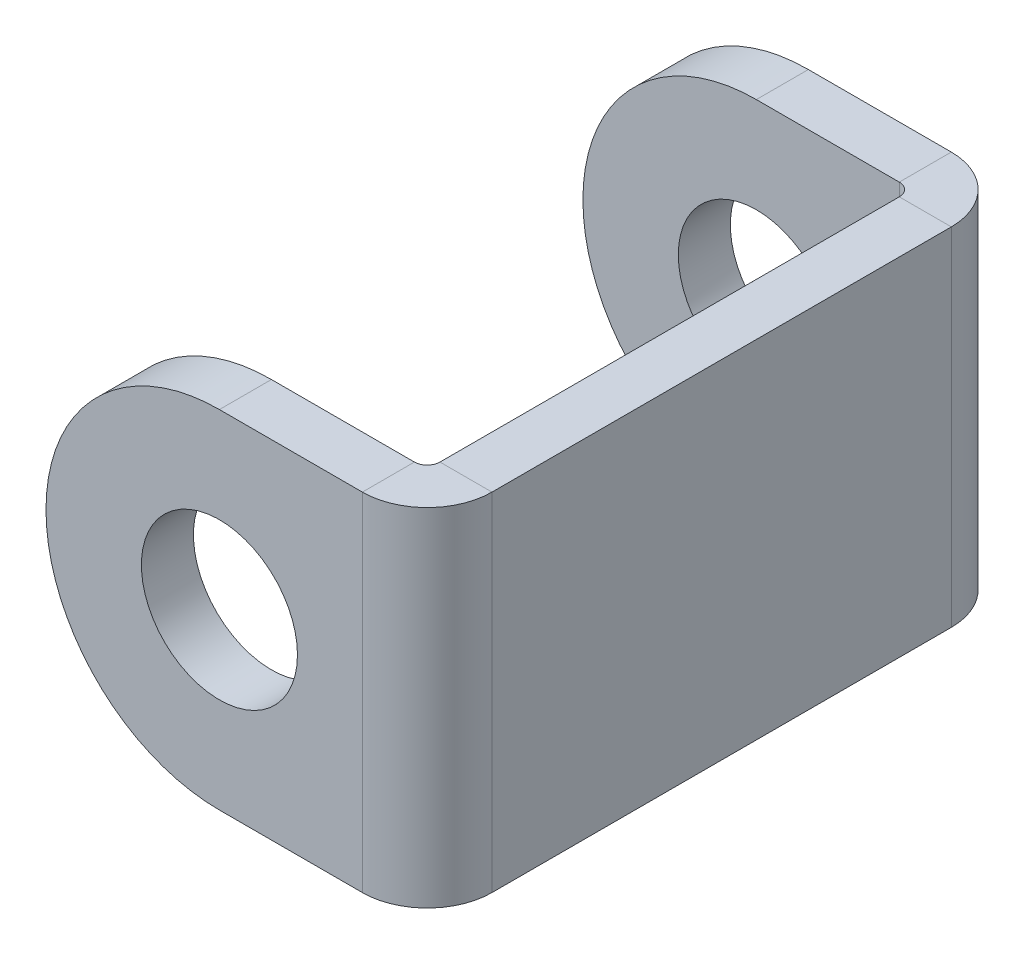
ISO-10303-21;
HEADER;
FILE_DESCRIPTION(('STEP AP214'),'2;1');
FILE_NAME('part.step','',(''),(''),'','','');
FILE_SCHEMA(('AUTOMOTIVE_DESIGN { 1 0 10303 214 1 1 1 1 }'));
ENDSEC;
DATA;
#1=APPLICATION_CONTEXT('core data for automotive mechanical design processes');
#2=APPLICATION_PROTOCOL_DEFINITION('international standard','automotive_design',2000,#1);
#3=PRODUCT_CONTEXT('',#1,'mechanical');
#4=PRODUCT('Part','Part','',(#3));
#5=PRODUCT_RELATED_PRODUCT_CATEGORY('part','',(#4));
#6=PRODUCT_DEFINITION_FORMATION('','',#4);
#7=PRODUCT_DEFINITION_CONTEXT('part definition',#1,'design');
#8=PRODUCT_DEFINITION('design','',#6,#7);
#9=PRODUCT_DEFINITION_SHAPE('','',#8);
#10=(LENGTH_UNIT() NAMED_UNIT(*) SI_UNIT(.MILLI.,.METRE.));
#11=(NAMED_UNIT(*) PLANE_ANGLE_UNIT() SI_UNIT($,.RADIAN.));
#12=(NAMED_UNIT(*) SI_UNIT($,.STERADIAN.) SOLID_ANGLE_UNIT());
#13=UNCERTAINTY_MEASURE_WITH_UNIT(LENGTH_MEASURE(1.E-05),#10,'distance_accuracy_value','');
#14=(GEOMETRIC_REPRESENTATION_CONTEXT(3) GLOBAL_UNCERTAINTY_ASSIGNED_CONTEXT((#13)) GLOBAL_UNIT_ASSIGNED_CONTEXT((#10,
#11,#12)) REPRESENTATION_CONTEXT('',''));
#15=CARTESIAN_POINT('',(0.,0.,0.));
#16=DIRECTION('',(0.,0.,1.));
#17=DIRECTION('',(1.,0.,0.));
#18=AXIS2_PLACEMENT_3D('',#15,#16,#17);
#19=CARTESIAN_POINT('',(18.9799784677453,0.,-21.0200215322547));
#20=DIRECTION('',(1.,0.,0.));
#21=DIRECTION('',(0.,0.,-1.));
#22=AXIS2_PLACEMENT_3D('',#19,#20,#21);
#23=PLANE('',#22);
#24=DIRECTION('',(0.,0.,1.));
#25=VECTOR('',#24,1.);
#26=CARTESIAN_POINT('',(18.9799784677453,0.,-21.0200215322547));
#27=LINE('',#26,#25);
#28=CARTESIAN_POINT('',(18.9799784677453,0.,0.736600000000002));
#29=VERTEX_POINT('',#28);
#30=CARTESIAN_POINT('',(18.9799784677452,0.,27.2233569354905));
#31=VERTEX_POINT('',#30);
#32=EDGE_CURVE('E204',#29,#31,#27,.T.);
#33=ORIENTED_EDGE('',*,*,#32,.T.);
#34=DIRECTION('',(0.,1.,0.));
#35=VECTOR('',#34,1.);
#36=CARTESIAN_POINT('',(18.9799784677452,0.,27.2233569354905));
#37=LINE('',#36,#35);
#38=CARTESIAN_POINT('',(18.9799784677452,20.,27.2233569354905));
#39=VERTEX_POINT('',#38);
#40=EDGE_CURVE('E238',#31,#39,#37,.T.);
#41=ORIENTED_EDGE('',*,*,#40,.T.);
#42=DIRECTION('',(0.,0.,-1.));
#43=VECTOR('',#42,1.);
#44=CARTESIAN_POINT('',(18.9799784677453,20.,-21.0200215322547));
#45=LINE('',#44,#43);
#46=CARTESIAN_POINT('',(18.9799784677453,20.,0.736600000000002));
#47=VERTEX_POINT('',#46);
#48=EDGE_CURVE('E247',#39,#47,#45,.T.);
#49=ORIENTED_EDGE('',*,*,#48,.T.);
#50=DIRECTION('',(0.,1.,0.));
#51=VECTOR('',#50,1.);
#52=CARTESIAN_POINT('',(18.9799784677453,0.,0.736600000000004));
#53=LINE('',#52,#51);
#54=EDGE_CURVE('E230',#29,#47,#53,.T.);
#55=ORIENTED_EDGE('',*,*,#54,.F.);
#56=EDGE_LOOP('',(#33,#41,#49,#55));
#57=FACE_BOUND('',#56,.T.);
#58=ADVANCED_FACE('F44',(#57),#23,.F.);
#59=CARTESIAN_POINT('',(21.9799784677453,0.,-21.0200215322547));
#60=DIRECTION('',(0.,-1.,0.));
#61=DIRECTION('',(1.,0.,0.));
#62=AXIS2_PLACEMENT_3D('',#59,#60,#61);
#63=PLANE('',#62);
#64=DIRECTION('',(1.,0.,0.));
#65=VECTOR('',#64,1.);
#66=CARTESIAN_POINT('',(21.9799784677452,0.,27.2233569354905));
#67=LINE('',#66,#65);
#68=CARTESIAN_POINT('',(21.9799784677452,0.,27.2233569354905));
#69=VERTEX_POINT('',#68);
#70=EDGE_CURVE('E241',#31,#69,#67,.T.);
#71=ORIENTED_EDGE('',*,*,#70,.F.);
#72=ORIENTED_EDGE('',*,*,#32,.F.);
#73=DIRECTION('',(1.,0.,0.));
#74=VECTOR('',#73,1.);
#75=CARTESIAN_POINT('',(21.9799784677453,0.,0.736600000000014));
#76=LINE('',#75,#74);
#77=CARTESIAN_POINT('',(21.9799784677453,0.,0.736600000000012));
#78=VERTEX_POINT('',#77);
#79=EDGE_CURVE('E226',#29,#78,#76,.T.);
#80=ORIENTED_EDGE('',*,*,#79,.T.);
#81=DIRECTION('',(0.,0.,1.));
#82=VECTOR('',#81,1.);
#83=CARTESIAN_POINT('',(21.9799784677453,0.,-21.0200215322547));
#84=LINE('',#83,#82);
#85=EDGE_CURVE('E245',#78,#69,#84,.T.);
#86=ORIENTED_EDGE('',*,*,#85,.T.);
#87=EDGE_LOOP('',(#71,#72,#80,#86));
#88=FACE_BOUND('',#87,.T.);
#89=ADVANCED_FACE('F326',(#88),#63,.T.);
#90=CARTESIAN_POINT('',(21.9799784677453,20.,-21.0200215322547));
#91=DIRECTION('',(0.,1.,0.));
#92=DIRECTION('',(-1.,0.,0.));
#93=AXIS2_PLACEMENT_3D('',#90,#91,#92);
#94=PLANE('',#93);
#95=DIRECTION('',(-1.,0.,0.));
#96=VECTOR('',#95,1.);
#97=CARTESIAN_POINT('',(21.9799784677452,20.,27.2233569354905));
#98=LINE('',#97,#96);
#99=CARTESIAN_POINT('',(21.9799784677452,20.,27.2233569354905));
#100=VERTEX_POINT('',#99);
#101=EDGE_CURVE('E236',#100,#39,#98,.T.);
#102=ORIENTED_EDGE('',*,*,#101,.F.);
#103=DIRECTION('',(0.,0.,-1.));
#104=VECTOR('',#103,1.);
#105=CARTESIAN_POINT('',(21.9799784677453,20.,-21.0200215322547));
#106=LINE('',#105,#104);
#107=CARTESIAN_POINT('',(21.9799784677453,20.,0.736600000000014));
#108=VERTEX_POINT('',#107);
#109=EDGE_CURVE('E227',#100,#108,#106,.T.);
#110=ORIENTED_EDGE('',*,*,#109,.T.);
#111=DIRECTION('',(-1.,0.,0.));
#112=VECTOR('',#111,1.);
#113=CARTESIAN_POINT('',(21.9799784677453,20.,0.736600000000014));
#114=LINE('',#113,#112);
#115=EDGE_CURVE('E232',#108,#47,#114,.T.);
#116=ORIENTED_EDGE('',*,*,#115,.T.);
#117=ORIENTED_EDGE('',*,*,#48,.F.);
#118=EDGE_LOOP('',(#102,#110,#116,#117));
#119=FACE_BOUND('',#118,.T.);
#120=ADVANCED_FACE('F332',(#119),#94,.T.);
#121=CARTESIAN_POINT('',(21.9799784677453,0.,-21.0200215322547));
#122=DIRECTION('',(1.,0.,0.));
#123=DIRECTION('',(0.,0.,-1.));
#124=AXIS2_PLACEMENT_3D('',#121,#122,#123);
#125=PLANE('',#124);
#126=DIRECTION('',(0.,1.,0.));
#127=VECTOR('',#126,1.);
#128=CARTESIAN_POINT('',(21.9799784677452,0.,27.2233569354905));
#129=LINE('',#128,#127);
#130=EDGE_CURVE('E180',#69,#100,#129,.T.);
#131=ORIENTED_EDGE('',*,*,#130,.F.);
#132=ORIENTED_EDGE('',*,*,#85,.F.);
#133=DIRECTION('',(0.,1.,0.));
#134=VECTOR('',#133,1.);
#135=CARTESIAN_POINT('',(21.9799784677453,0.,0.736600000000014));
#136=LINE('',#135,#134);
#137=EDGE_CURVE('E223',#78,#108,#136,.T.);
#138=ORIENTED_EDGE('',*,*,#137,.T.);
#139=ORIENTED_EDGE('',*,*,#109,.F.);
#140=EDGE_LOOP('',(#131,#132,#138,#139));
#141=FACE_BOUND('',#140,.T.);
#142=ADVANCED_FACE('F338',(#141),#125,.T.);
#143=CARTESIAN_POINT('',(0.,0.,-3.));
#144=DIRECTION('',(0.,0.,-1.));
#145=DIRECTION('',(-1.,0.,0.));
#146=AXIS2_PLACEMENT_3D('',#143,#144,#145);
#147=PLANE('',#146);
#148=CARTESIAN_POINT('',(9.99999999999985,10.,-3.));
#149=DIRECTION('',(0.,0.,1.));
#150=DIRECTION('',(1.,0.,0.));
#151=AXIS2_PLACEMENT_3D('',#148,#149,#150);
#152=CIRCLE('',#151,4.5);
#153=CARTESIAN_POINT('',(14.4999999999998,10.,-3.));
#154=VERTEX_POINT('',#153);
#155=EDGE_CURVE('E286',#154,#154,#152,.T.);
#156=ORIENTED_EDGE('',*,*,#155,.T.);
#157=EDGE_LOOP('',(#156));
#158=FACE_BOUND('',#157,.T.);
#159=DIRECTION('',(1.,0.,0.));
#160=VECTOR('',#159,1.);
#161=CARTESIAN_POINT('',(0.,0.,-3.));
#162=LINE('',#161,#160);
#163=CARTESIAN_POINT('',(10.,0.,-3.));
#164=VERTEX_POINT('',#163);
#165=CARTESIAN_POINT('',(18.2433784677453,0.,-3.));
#166=VERTEX_POINT('',#165);
#167=EDGE_CURVE('E213',#164,#166,#162,.T.);
#168=ORIENTED_EDGE('',*,*,#167,.F.);
#169=CARTESIAN_POINT('',(10.,10.,-3.));
#170=DIRECTION('',(0.,0.,-1.));
#171=DIRECTION('',(-1.,0.,0.));
#172=AXIS2_PLACEMENT_3D('',#169,#170,#171);
#173=CIRCLE('',#172,10.);
#174=CARTESIAN_POINT('',(0.,10.,-3.));
#175=VERTEX_POINT('',#174);
#176=EDGE_CURVE('E66',#164,#175,#173,.T.);
#177=ORIENTED_EDGE('',*,*,#176,.T.);
#178=CARTESIAN_POINT('',(10.,10.,-3.));
#179=DIRECTION('',(0.,0.,-1.));
#180=DIRECTION('',(-1.,0.,0.));
#181=AXIS2_PLACEMENT_3D('',#178,#179,#180);
#182=CIRCLE('',#181,10.);
#183=CARTESIAN_POINT('',(10.,20.,-3.));
#184=VERTEX_POINT('',#183);
#185=EDGE_CURVE('E61',#175,#184,#182,.T.);
#186=ORIENTED_EDGE('',*,*,#185,.T.);
#187=DIRECTION('',(-1.,0.,0.));
#188=VECTOR('',#187,1.);
#189=CARTESIAN_POINT('',(0.,20.,-3.));
#190=LINE('',#189,#188);
#191=CARTESIAN_POINT('',(18.2433784677453,20.,-3.));
#192=VERTEX_POINT('',#191);
#193=EDGE_CURVE('E202',#192,#184,#190,.T.);
#194=ORIENTED_EDGE('',*,*,#193,.F.);
#195=DIRECTION('',(0.,1.,0.));
#196=VECTOR('',#195,1.);
#197=CARTESIAN_POINT('',(18.2433784677453,0.,-3.));
#198=LINE('',#197,#196);
#199=EDGE_CURVE('E198',#166,#192,#198,.T.);
#200=ORIENTED_EDGE('',*,*,#199,.F.);
#201=EDGE_LOOP('',(#168,#177,#186,#194,#200));
#202=FACE_BOUND('',#201,.T.);
#203=ADVANCED_FACE('F342',(#158,#202),#147,.T.);
#204=CARTESIAN_POINT('',(0.,0.,-3.));
#205=DIRECTION('',(0.,-1.,0.));
#206=DIRECTION('',(0.,0.,-1.));
#207=AXIS2_PLACEMENT_3D('',#204,#205,#206);
#208=PLANE('',#207);
#209=DIRECTION('',(1.,0.,0.));
#210=VECTOR('',#209,1.);
#211=CARTESIAN_POINT('',(0.,0.,0.));
#212=LINE('',#211,#210);
#213=CARTESIAN_POINT('',(10.,0.,0.));
#214=VERTEX_POINT('',#213);
#215=CARTESIAN_POINT('',(18.2433784677453,0.,0.));
#216=VERTEX_POINT('',#215);
#217=EDGE_CURVE('E211',#214,#216,#212,.T.);
#218=ORIENTED_EDGE('',*,*,#217,.F.);
#219=DIRECTION('',(0.,0.,1.));
#220=VECTOR('',#219,1.);
#221=CARTESIAN_POINT('',(10.,0.,-3.));
#222=LINE('',#221,#220);
#223=EDGE_CURVE('E267',#214,#164,#222,.F.);
#224=ORIENTED_EDGE('',*,*,#223,.T.);
#225=ORIENTED_EDGE('',*,*,#167,.T.);
#226=DIRECTION('',(0.,0.,-1.));
#227=VECTOR('',#226,1.);
#228=CARTESIAN_POINT('',(18.2433784677453,0.,-3.));
#229=LINE('',#228,#227);
#230=EDGE_CURVE('E215',#216,#166,#229,.T.);
#231=ORIENTED_EDGE('',*,*,#230,.F.);
#232=EDGE_LOOP('',(#218,#224,#225,#231));
#233=FACE_BOUND('',#232,.T.);
#234=ADVANCED_FACE('F352',(#233),#208,.T.);
#235=CARTESIAN_POINT('',(0.,0.,0.));
#236=DIRECTION('',(0.,0.,-1.));
#237=DIRECTION('',(-1.,0.,0.));
#238=AXIS2_PLACEMENT_3D('',#235,#236,#237);
#239=PLANE('',#238);
#240=CARTESIAN_POINT('',(9.99999999999985,10.,0.));
#241=DIRECTION('',(0.,0.,-1.));
#242=DIRECTION('',(-1.,0.,0.));
#243=AXIS2_PLACEMENT_3D('',#240,#241,#242);
#244=CIRCLE('',#243,4.5);
#245=CARTESIAN_POINT('',(5.49999999999985,10.,0.));
#246=VERTEX_POINT('',#245);
#247=EDGE_CURVE('E277',#246,#246,#244,.T.);
#248=ORIENTED_EDGE('',*,*,#247,.T.);
#249=EDGE_LOOP('',(#248));
#250=FACE_BOUND('',#249,.T.);
#251=CARTESIAN_POINT('',(10.,10.,0.));
#252=DIRECTION('',(0.,0.,-1.));
#253=DIRECTION('',(-1.,0.,0.));
#254=AXIS2_PLACEMENT_3D('',#251,#252,#253);
#255=CIRCLE('',#254,10.);
#256=CARTESIAN_POINT('',(10.,20.,0.));
#257=VERTEX_POINT('',#256);
#258=CARTESIAN_POINT('',(0.,10.,0.));
#259=VERTEX_POINT('',#258);
#260=EDGE_CURVE('E263',#257,#259,#255,.F.);
#261=ORIENTED_EDGE('',*,*,#260,.T.);
#262=CARTESIAN_POINT('',(10.,10.,0.));
#263=DIRECTION('',(0.,0.,-1.));
#264=DIRECTION('',(-1.,0.,0.));
#265=AXIS2_PLACEMENT_3D('',#262,#263,#264);
#266=CIRCLE('',#265,10.);
#267=EDGE_CURVE('E265',#259,#214,#266,.F.);
#268=ORIENTED_EDGE('',*,*,#267,.T.);
#269=ORIENTED_EDGE('',*,*,#217,.T.);
#270=DIRECTION('',(0.,1.,0.));
#271=VECTOR('',#270,1.);
#272=CARTESIAN_POINT('',(18.2433784677453,0.,0.));
#273=LINE('',#272,#271);
#274=CARTESIAN_POINT('',(18.2433784677453,20.,0.));
#275=VERTEX_POINT('',#274);
#276=EDGE_CURVE('E208',#216,#275,#273,.T.);
#277=ORIENTED_EDGE('',*,*,#276,.T.);
#278=DIRECTION('',(-1.,0.,0.));
#279=VECTOR('',#278,1.);
#280=CARTESIAN_POINT('',(0.,20.,0.));
#281=LINE('',#280,#279);
#282=EDGE_CURVE('E205',#275,#257,#281,.T.);
#283=ORIENTED_EDGE('',*,*,#282,.T.);
#284=EDGE_LOOP('',(#261,#268,#269,#277,#283));
#285=FACE_BOUND('',#284,.T.);
#286=ADVANCED_FACE('F348',(#250,#285),#239,.F.);
#287=CARTESIAN_POINT('',(0.,20.,-3.));
#288=DIRECTION('',(0.,1.,0.));
#289=DIRECTION('',(0.,0.,1.));
#290=AXIS2_PLACEMENT_3D('',#287,#288,#289);
#291=PLANE('',#290);
#292=ORIENTED_EDGE('',*,*,#193,.T.);
#293=DIRECTION('',(0.,0.,1.));
#294=VECTOR('',#293,1.);
#295=CARTESIAN_POINT('',(10.,20.,-3.));
#296=LINE('',#295,#294);
#297=EDGE_CURVE('E12',#184,#257,#296,.T.);
#298=ORIENTED_EDGE('',*,*,#297,.T.);
#299=ORIENTED_EDGE('',*,*,#282,.F.);
#300=DIRECTION('',(0.,0.,1.));
#301=VECTOR('',#300,1.);
#302=CARTESIAN_POINT('',(18.2433784677453,20.,-3.));
#303=LINE('',#302,#301);
#304=EDGE_CURVE('E218',#192,#275,#303,.T.);
#305=ORIENTED_EDGE('',*,*,#304,.F.);
#306=EDGE_LOOP('',(#292,#298,#299,#305));
#307=FACE_BOUND('',#306,.T.);
#308=ADVANCED_FACE('F344',(#307),#291,.T.);
#309=CARTESIAN_POINT('',(18.2433784677453,0.,0.7366));
#310=DIRECTION('',(0.,-1.,0.));
#311=DIRECTION('',(1.,0.,0.));
#312=AXIS2_PLACEMENT_3D('',#309,#310,#311);
#313=PLANE('',#312);
#314=ORIENTED_EDGE('',*,*,#79,.F.);
#315=CARTESIAN_POINT('',(18.2433784677453,0.,0.7366));
#316=DIRECTION('',(0.,-1.,0.));
#317=DIRECTION('',(1.,0.,0.));
#318=AXIS2_PLACEMENT_3D('',#315,#316,#317);
#319=CIRCLE('',#318,0.7366);
#320=EDGE_CURVE('E181',#29,#216,#319,.F.);
#321=ORIENTED_EDGE('',*,*,#320,.T.);
#322=ORIENTED_EDGE('',*,*,#230,.T.);
#323=CARTESIAN_POINT('',(18.2433784677453,0.,0.7366));
#324=DIRECTION('',(0.,1.,0.));
#325=DIRECTION('',(1.,0.,0.));
#326=AXIS2_PLACEMENT_3D('',#323,#324,#325);
#327=CIRCLE('',#326,3.7366);
#328=EDGE_CURVE('E194',#78,#166,#327,.T.);
#329=ORIENTED_EDGE('',*,*,#328,.F.);
#330=EDGE_LOOP('',(#314,#321,#322,#329));
#331=FACE_BOUND('',#330,.T.);
#332=ADVANCED_FACE('F347',(#331),#313,.T.);
#333=CARTESIAN_POINT('',(18.2433784677453,20.,0.7366));
#334=DIRECTION('',(0.,1.,0.));
#335=DIRECTION('',(0.,0.,1.));
#336=AXIS2_PLACEMENT_3D('',#333,#334,#335);
#337=PLANE('',#336);
#338=CARTESIAN_POINT('',(18.2433784677453,20.,0.7366));
#339=DIRECTION('',(0.,-1.,0.));
#340=DIRECTION('',(1.,0.,0.));
#341=AXIS2_PLACEMENT_3D('',#338,#339,#340);
#342=CIRCLE('',#341,0.7366);
#343=EDGE_CURVE('E185',#275,#47,#342,.T.);
#344=ORIENTED_EDGE('',*,*,#343,.T.);
#345=ORIENTED_EDGE('',*,*,#115,.F.);
#346=CARTESIAN_POINT('',(18.2433784677453,20.,0.7366));
#347=DIRECTION('',(0.,-1.,0.));
#348=DIRECTION('',(0.,0.,1.));
#349=AXIS2_PLACEMENT_3D('',#346,#347,#348);
#350=CIRCLE('',#349,3.7366);
#351=EDGE_CURVE('E197',#192,#108,#350,.T.);
#352=ORIENTED_EDGE('',*,*,#351,.F.);
#353=ORIENTED_EDGE('',*,*,#304,.T.);
#354=EDGE_LOOP('',(#344,#345,#352,#353));
#355=FACE_BOUND('',#354,.T.);
#356=ADVANCED_FACE('F359',(#355),#337,.T.);
#357=CARTESIAN_POINT('',(18.2433784677453,30.5266382252507,0.7366));
#358=DIRECTION('',(0.,-1.,0.));
#359=DIRECTION('',(1.,0.,0.));
#360=AXIS2_PLACEMENT_3D('',#357,#358,#359);
#361=CYLINDRICAL_SURFACE('',#360,3.7366);
#362=ORIENTED_EDGE('',*,*,#199,.T.);
#363=ORIENTED_EDGE('',*,*,#351,.T.);
#364=ORIENTED_EDGE('',*,*,#137,.F.);
#365=ORIENTED_EDGE('',*,*,#328,.T.);
#366=EDGE_LOOP('',(#362,#363,#364,#365));
#367=FACE_BOUND('',#366,.T.);
#368=ADVANCED_FACE('F362',(#367),#361,.T.);
#369=CARTESIAN_POINT('',(18.2433784677453,30.5266382252507,0.7366));
#370=DIRECTION('',(0.,-1.,0.));
#371=DIRECTION('',(1.,0.,0.));
#372=AXIS2_PLACEMENT_3D('',#369,#370,#371);
#373=CYLINDRICAL_SURFACE('',#372,0.7366);
#374=ORIENTED_EDGE('',*,*,#276,.F.);
#375=ORIENTED_EDGE('',*,*,#320,.F.);
#376=ORIENTED_EDGE('',*,*,#54,.T.);
#377=ORIENTED_EDGE('',*,*,#343,.F.);
#378=EDGE_LOOP('',(#374,#375,#376,#377));
#379=FACE_BOUND('',#378,.T.);
#380=ADVANCED_FACE('F367',(#379),#373,.F.);
#381=CARTESIAN_POINT('',(18.2433784677452,0.,27.2233569354905));
#382=DIRECTION('',(0.,-1.,0.));
#383=DIRECTION('',(1.,0.,0.));
#384=AXIS2_PLACEMENT_3D('',#381,#382,#383);
#385=PLANE('',#384);
#386=DIRECTION('',(0.,0.,1.));
#387=VECTOR('',#386,1.);
#388=CARTESIAN_POINT('',(18.2433784677451,0.,30.9599569354905));
#389=LINE('',#388,#387);
#390=CARTESIAN_POINT('',(18.2433784677452,0.,27.9599569354905));
#391=VERTEX_POINT('',#390);
#392=CARTESIAN_POINT('',(18.2433784677451,0.,30.9599569354905));
#393=VERTEX_POINT('',#392);
#394=EDGE_CURVE('E292',#391,#393,#389,.T.);
#395=ORIENTED_EDGE('',*,*,#394,.F.);
#396=CARTESIAN_POINT('',(18.2433784677452,0.,27.2233569354905));
#397=DIRECTION('',(0.,-1.,0.));
#398=DIRECTION('',(1.,0.,0.));
#399=AXIS2_PLACEMENT_3D('',#396,#397,#398);
#400=CIRCLE('',#399,0.7366);
#401=EDGE_CURVE('E190',#391,#31,#400,.F.);
#402=ORIENTED_EDGE('',*,*,#401,.T.);
#403=ORIENTED_EDGE('',*,*,#70,.T.);
#404=CARTESIAN_POINT('',(18.2433784677452,0.,27.2233569354905));
#405=DIRECTION('',(0.,1.,0.));
#406=DIRECTION('',(1.,0.,0.));
#407=AXIS2_PLACEMENT_3D('',#404,#405,#406);
#408=CIRCLE('',#407,3.7366);
#409=EDGE_CURVE('E182',#393,#69,#408,.T.);
#410=ORIENTED_EDGE('',*,*,#409,.F.);
#411=EDGE_LOOP('',(#395,#402,#403,#410));
#412=FACE_BOUND('',#411,.T.);
#413=ADVANCED_FACE('F306',(#412),#385,.T.);
#414=CARTESIAN_POINT('',(18.2433784677452,20.,27.2233569354905));
#415=DIRECTION('',(0.,1.,0.));
#416=DIRECTION('',(0.,0.,1.));
#417=AXIS2_PLACEMENT_3D('',#414,#415,#416);
#418=PLANE('',#417);
#419=CARTESIAN_POINT('',(18.2433784677452,20.,27.2233569354905));
#420=DIRECTION('',(0.,-1.,0.));
#421=DIRECTION('',(1.,0.,0.));
#422=AXIS2_PLACEMENT_3D('',#419,#420,#421);
#423=CIRCLE('',#422,0.7366);
#424=CARTESIAN_POINT('',(18.2433784677452,20.,27.9599569354905));
#425=VERTEX_POINT('',#424);
#426=EDGE_CURVE('E174',#39,#425,#423,.T.);
#427=ORIENTED_EDGE('',*,*,#426,.T.);
#428=DIRECTION('',(0.,0.,-1.));
#429=VECTOR('',#428,1.);
#430=CARTESIAN_POINT('',(18.2433784677451,20.,30.9599569354905));
#431=LINE('',#430,#429);
#432=CARTESIAN_POINT('',(18.2433784677451,20.,30.9599569354905));
#433=VERTEX_POINT('',#432);
#434=EDGE_CURVE('E149',#433,#425,#431,.T.);
#435=ORIENTED_EDGE('',*,*,#434,.F.);
#436=CARTESIAN_POINT('',(18.2433784677452,20.,27.2233569354905));
#437=DIRECTION('',(0.,-1.,0.));
#438=DIRECTION('',(0.,0.,1.));
#439=AXIS2_PLACEMENT_3D('',#436,#437,#438);
#440=CIRCLE('',#439,3.7366);
#441=EDGE_CURVE('E172',#100,#433,#440,.T.);
#442=ORIENTED_EDGE('',*,*,#441,.F.);
#443=ORIENTED_EDGE('',*,*,#101,.T.);
#444=EDGE_LOOP('',(#427,#435,#442,#443));
#445=FACE_BOUND('',#444,.T.);
#446=ADVANCED_FACE('F170',(#445),#418,.T.);
#447=CARTESIAN_POINT('',(18.2433784677452,30.5266382252507,27.2233569354905));
#448=DIRECTION('',(0.,-1.,0.));
#449=DIRECTION('',(1.,0.,0.));
#450=AXIS2_PLACEMENT_3D('',#447,#448,#449);
#451=CYLINDRICAL_SURFACE('',#450,3.7366);
#452=ORIENTED_EDGE('',*,*,#130,.T.);
#453=ORIENTED_EDGE('',*,*,#441,.T.);
#454=DIRECTION('',(0.,1.,0.));
#455=VECTOR('',#454,1.);
#456=CARTESIAN_POINT('',(18.2433784677451,0.,30.9599569354905));
#457=LINE('',#456,#455);
#458=EDGE_CURVE('E154',#393,#433,#457,.T.);
#459=ORIENTED_EDGE('',*,*,#458,.F.);
#460=ORIENTED_EDGE('',*,*,#409,.T.);
#461=EDGE_LOOP('',(#452,#453,#459,#460));
#462=FACE_BOUND('',#461,.T.);
#463=ADVANCED_FACE('F178',(#462),#451,.T.);
#464=CARTESIAN_POINT('',(18.2433784677452,30.5266382252507,27.2233569354905));
#465=DIRECTION('',(0.,-1.,0.));
#466=DIRECTION('',(1.,0.,0.));
#467=AXIS2_PLACEMENT_3D('',#464,#465,#466);
#468=CYLINDRICAL_SURFACE('',#467,0.7366);
#469=ORIENTED_EDGE('',*,*,#40,.F.);
#470=ORIENTED_EDGE('',*,*,#401,.F.);
#471=DIRECTION('',(0.,1.,0.));
#472=VECTOR('',#471,1.);
#473=CARTESIAN_POINT('',(18.2433784677452,0.,27.9599569354905));
#474=LINE('',#473,#472);
#475=EDGE_CURVE('E165',#391,#425,#474,.T.);
#476=ORIENTED_EDGE('',*,*,#475,.T.);
#477=ORIENTED_EDGE('',*,*,#426,.F.);
#478=EDGE_LOOP('',(#469,#470,#476,#477));
#479=FACE_BOUND('',#478,.T.);
#480=ADVANCED_FACE('F301',(#479),#468,.F.);
#481=CARTESIAN_POINT('',(69.9999999999999,0.,30.9599569354909));
#482=DIRECTION('',(0.,0.,1.));
#483=DIRECTION('',(1.,0.,0.));
#484=AXIS2_PLACEMENT_3D('',#481,#482,#483);
#485=PLANE('',#484);
#486=CARTESIAN_POINT('',(9.99999999999985,10.,30.9599569354904));
#487=DIRECTION('',(0.,0.,1.));
#488=DIRECTION('',(1.,0.,0.));
#489=AXIS2_PLACEMENT_3D('',#486,#487,#488);
#490=CIRCLE('',#489,4.5);
#491=CARTESIAN_POINT('',(14.4999999999998,10.,30.9599569354904));
#492=VERTEX_POINT('',#491);
#493=EDGE_CURVE('E289',#492,#492,#490,.T.);
#494=ORIENTED_EDGE('',*,*,#493,.F.);
#495=EDGE_LOOP('',(#494));
#496=FACE_BOUND('',#495,.T.);
#497=CARTESIAN_POINT('',(9.99999999999988,10.,30.9599569354905));
#498=DIRECTION('',(0.,0.,1.));
#499=DIRECTION('',(1.,0.,0.));
#500=AXIS2_PLACEMENT_3D('',#497,#498,#499);
#501=CIRCLE('',#500,10.);
#502=CARTESIAN_POINT('',(9.99999999999988,20.,30.9599569354905));
#503=VERTEX_POINT('',#502);
#504=CARTESIAN_POINT('',(-1.196959198424E-13,10.,30.9599569354904));
#505=VERTEX_POINT('',#504);
#506=EDGE_CURVE('E259',#503,#505,#501,.T.);
#507=ORIENTED_EDGE('',*,*,#506,.T.);
#508=CARTESIAN_POINT('',(9.99999999999988,10.,30.9599569354905));
#509=DIRECTION('',(0.,0.,1.));
#510=DIRECTION('',(1.,0.,0.));
#511=AXIS2_PLACEMENT_3D('',#508,#509,#510);
#512=CIRCLE('',#511,10.);
#513=CARTESIAN_POINT('',(9.99999999999988,0.,30.9599569354905));
#514=VERTEX_POINT('',#513);
#515=EDGE_CURVE('E261',#505,#514,#512,.T.);
#516=ORIENTED_EDGE('',*,*,#515,.T.);
#517=DIRECTION('',(-1.,0.,0.));
#518=VECTOR('',#517,1.);
#519=CARTESIAN_POINT('',(69.9999999999999,0.,30.9599569354909));
#520=LINE('',#519,#518);
#521=EDGE_CURVE('E160',#393,#514,#520,.T.);
#522=ORIENTED_EDGE('',*,*,#521,.F.);
#523=ORIENTED_EDGE('',*,*,#458,.T.);
#524=DIRECTION('',(1.,0.,0.));
#525=VECTOR('',#524,1.);
#526=CARTESIAN_POINT('',(69.9999999999999,20.,30.9599569354909));
#527=LINE('',#526,#525);
#528=EDGE_CURVE('E144',#503,#433,#527,.T.);
#529=ORIENTED_EDGE('',*,*,#528,.F.);
#530=EDGE_LOOP('',(#507,#516,#522,#523,#529));
#531=FACE_BOUND('',#530,.T.);
#532=ADVANCED_FACE('F158',(#496,#531),#485,.T.);
#533=CARTESIAN_POINT('',(69.9999999999999,20.,30.9599569354909));
#534=DIRECTION('',(0.,1.,0.));
#535=DIRECTION('',(0.,0.,-1.));
#536=AXIS2_PLACEMENT_3D('',#533,#534,#535);
#537=PLANE('',#536);
#538=DIRECTION('',(1.,0.,0.));
#539=VECTOR('',#538,1.);
#540=CARTESIAN_POINT('',(69.9999999999999,20.,27.9599569354909));
#541=LINE('',#540,#539);
#542=CARTESIAN_POINT('',(9.9999999999999,20.,27.9599569354905));
#543=VERTEX_POINT('',#542);
#544=EDGE_CURVE('E294',#543,#425,#541,.T.);
#545=ORIENTED_EDGE('',*,*,#544,.F.);
#546=DIRECTION('',(0.,0.,-1.));
#547=VECTOR('',#546,1.);
#548=CARTESIAN_POINT('',(9.99999999999988,20.,30.9599569354905));
#549=LINE('',#548,#547);
#550=EDGE_CURVE('E53',#543,#503,#549,.F.);
#551=ORIENTED_EDGE('',*,*,#550,.T.);
#552=ORIENTED_EDGE('',*,*,#528,.T.);
#553=ORIENTED_EDGE('',*,*,#434,.T.);
#554=EDGE_LOOP('',(#545,#551,#552,#553));
#555=FACE_BOUND('',#554,.T.);
#556=ADVANCED_FACE('F147',(#555),#537,.T.);
#557=CARTESIAN_POINT('',(69.9999999999999,0.,27.9599569354909));
#558=DIRECTION('',(0.,0.,1.));
#559=DIRECTION('',(1.,0.,0.));
#560=AXIS2_PLACEMENT_3D('',#557,#558,#559);
#561=PLANE('',#560);
#562=CARTESIAN_POINT('',(9.99999999999985,10.,27.9599569354905));
#563=DIRECTION('',(0.,0.,1.));
#564=DIRECTION('',(1.,0.,0.));
#565=AXIS2_PLACEMENT_3D('',#562,#563,#564);
#566=CIRCLE('',#565,4.5);
#567=CARTESIAN_POINT('',(14.4999999999998,10.,27.9599569354905));
#568=VERTEX_POINT('',#567);
#569=EDGE_CURVE('E48',#568,#568,#566,.T.);
#570=ORIENTED_EDGE('',*,*,#569,.T.);
#571=EDGE_LOOP('',(#570));
#572=FACE_BOUND('',#571,.T.);
#573=DIRECTION('',(-1.,0.,0.));
#574=VECTOR('',#573,1.);
#575=CARTESIAN_POINT('',(69.9999999999999,0.,27.9599569354909));
#576=LINE('',#575,#574);
#577=CARTESIAN_POINT('',(9.9999999999999,0.,27.9599569354905));
#578=VERTEX_POINT('',#577);
#579=EDGE_CURVE('E175',#391,#578,#576,.T.);
#580=ORIENTED_EDGE('',*,*,#579,.T.);
#581=CARTESIAN_POINT('',(9.9999999999999,10.,27.9599569354905));
#582=DIRECTION('',(0.,0.,1.));
#583=DIRECTION('',(1.,0.,0.));
#584=AXIS2_PLACEMENT_3D('',#581,#582,#583);
#585=CIRCLE('',#584,10.);
#586=CARTESIAN_POINT('',(0.,10.,27.9599569354904));
#587=VERTEX_POINT('',#586);
#588=EDGE_CURVE('E257',#578,#587,#585,.F.);
#589=ORIENTED_EDGE('',*,*,#588,.T.);
#590=CARTESIAN_POINT('',(9.9999999999999,10.,27.9599569354905));
#591=DIRECTION('',(0.,0.,1.));
#592=DIRECTION('',(1.,0.,0.));
#593=AXIS2_PLACEMENT_3D('',#590,#591,#592);
#594=CIRCLE('',#593,10.);
#595=EDGE_CURVE('E255',#587,#543,#594,.F.);
#596=ORIENTED_EDGE('',*,*,#595,.T.);
#597=ORIENTED_EDGE('',*,*,#544,.T.);
#598=ORIENTED_EDGE('',*,*,#475,.F.);
#599=EDGE_LOOP('',(#580,#589,#596,#597,#598));
#600=FACE_BOUND('',#599,.T.);
#601=ADVANCED_FACE('F304',(#572,#600),#561,.F.);
#602=CARTESIAN_POINT('',(69.9999999999999,0.,30.9599569354909));
#603=DIRECTION('',(0.,-1.,0.));
#604=DIRECTION('',(0.,0.,1.));
#605=AXIS2_PLACEMENT_3D('',#602,#603,#604);
#606=PLANE('',#605);
#607=ORIENTED_EDGE('',*,*,#521,.T.);
#608=DIRECTION('',(0.,0.,-1.));
#609=VECTOR('',#608,1.);
#610=CARTESIAN_POINT('',(9.99999999999988,0.,30.9599569354905));
#611=LINE('',#610,#609);
#612=EDGE_CURVE('E244',#514,#578,#611,.T.);
#613=ORIENTED_EDGE('',*,*,#612,.T.);
#614=ORIENTED_EDGE('',*,*,#579,.F.);
#615=ORIENTED_EDGE('',*,*,#394,.T.);
#616=EDGE_LOOP('',(#607,#613,#614,#615));
#617=FACE_BOUND('',#616,.T.);
#618=ADVANCED_FACE('F308',(#617),#606,.T.);
#619=CARTESIAN_POINT('',(9.99999999999988,10.,30.9599569354905));
#620=DIRECTION('',(0.,0.,-1.));
#621=DIRECTION('',(-1.,0.,0.));
#622=AXIS2_PLACEMENT_3D('',#619,#620,#621);
#623=CYLINDRICAL_SURFACE('',#622,10.);
#624=DIRECTION('',(0.,0.,-1.));
#625=VECTOR('',#624,1.);
#626=CARTESIAN_POINT('',(-1.196959198424E-13,10.,30.9599569354904));
#627=LINE('',#626,#625);
#628=EDGE_CURVE('E273',#505,#587,#627,.T.);
#629=ORIENTED_EDGE('',*,*,#628,.F.);
#630=ORIENTED_EDGE('',*,*,#506,.F.);
#631=ORIENTED_EDGE('',*,*,#550,.F.);
#632=ORIENTED_EDGE('',*,*,#595,.F.);
#633=EDGE_LOOP('',(#629,#630,#631,#632));
#634=FACE_BOUND('',#633,.T.);
#635=ADVANCED_FACE('F316',(#634),#623,.T.);
#636=CARTESIAN_POINT('',(9.99999999999988,10.,30.9599569354905));
#637=DIRECTION('',(0.,0.,-1.));
#638=DIRECTION('',(-1.,0.,0.));
#639=AXIS2_PLACEMENT_3D('',#636,#637,#638);
#640=CYLINDRICAL_SURFACE('',#639,10.);
#641=ORIENTED_EDGE('',*,*,#515,.F.);
#642=ORIENTED_EDGE('',*,*,#628,.T.);
#643=ORIENTED_EDGE('',*,*,#588,.F.);
#644=ORIENTED_EDGE('',*,*,#612,.F.);
#645=EDGE_LOOP('',(#641,#642,#643,#644));
#646=FACE_BOUND('',#645,.T.);
#647=ADVANCED_FACE('F312',(#646),#640,.T.);
#648=CARTESIAN_POINT('',(10.,10.,-3.));
#649=DIRECTION('',(0.,0.,1.));
#650=DIRECTION('',(1.,0.,0.));
#651=AXIS2_PLACEMENT_3D('',#648,#649,#650);
#652=CYLINDRICAL_SURFACE('',#651,10.);
#653=ORIENTED_EDGE('',*,*,#297,.F.);
#654=ORIENTED_EDGE('',*,*,#185,.F.);
#655=DIRECTION('',(0.,0.,1.));
#656=VECTOR('',#655,1.);
#657=CARTESIAN_POINT('',(0.,10.,-3.));
#658=LINE('',#657,#656);
#659=EDGE_CURVE('E275',#259,#175,#658,.F.);
#660=ORIENTED_EDGE('',*,*,#659,.F.);
#661=ORIENTED_EDGE('',*,*,#260,.F.);
#662=EDGE_LOOP('',(#653,#654,#660,#661));
#663=FACE_BOUND('',#662,.T.);
#664=ADVANCED_FACE('F46',(#663),#652,.T.);
#665=CARTESIAN_POINT('',(10.,10.,-3.));
#666=DIRECTION('',(0.,0.,1.));
#667=DIRECTION('',(1.,0.,0.));
#668=AXIS2_PLACEMENT_3D('',#665,#666,#667);
#669=CYLINDRICAL_SURFACE('',#668,10.);
#670=ORIENTED_EDGE('',*,*,#176,.F.);
#671=ORIENTED_EDGE('',*,*,#223,.F.);
#672=ORIENTED_EDGE('',*,*,#267,.F.);
#673=ORIENTED_EDGE('',*,*,#659,.T.);
#674=EDGE_LOOP('',(#670,#671,#672,#673));
#675=FACE_BOUND('',#674,.T.);
#676=ADVANCED_FACE('F397',(#675),#669,.T.);
#677=CARTESIAN_POINT('',(9.99999999999985,10.,-3.));
#678=DIRECTION('',(0.,0.,1.));
#679=DIRECTION('',(1.,0.,0.));
#680=AXIS2_PLACEMENT_3D('',#677,#678,#679);
#681=CYLINDRICAL_SURFACE('',#680,4.5);
#682=ORIENTED_EDGE('',*,*,#493,.T.);
#683=EDGE_LOOP('',(#682));
#684=FACE_BOUND('',#683,.T.);
#685=ORIENTED_EDGE('',*,*,#569,.F.);
#686=EDGE_LOOP('',(#685));
#687=FACE_BOUND('',#686,.T.);
#688=ADVANCED_FACE('F392',(#684,#687),#681,.F.);
#689=ORIENTED_EDGE('',*,*,#155,.F.);
#690=EDGE_LOOP('',(#689));
#691=FACE_BOUND('',#690,.T.);
#692=ORIENTED_EDGE('',*,*,#247,.F.);
#693=EDGE_LOOP('',(#692));
#694=FACE_BOUND('',#693,.T.);
#695=ADVANCED_FACE('F390',(#691,#694),#681,.F.);
#696=CLOSED_SHELL('',(#58,#89,#120,#142,#203,#234,#286,#308,#332,#356,#368,#380,#413,#446,#463,
#480,#532,#556,#601,#618,#635,#647,#664,#676,#688,#695));
#697=MANIFOLD_SOLID_BREP('B2',#696);
#698=ADVANCED_BREP_SHAPE_REPRESENTATION('',(#18,#697),#14);
#699=SHAPE_DEFINITION_REPRESENTATION(#9,#698);
ENDSEC;
END-ISO-10303-21;
